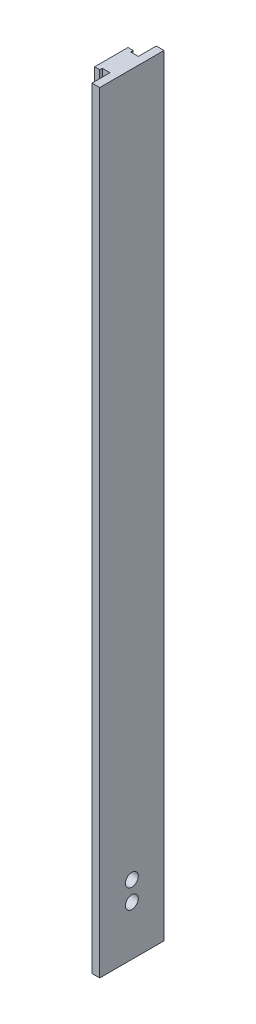
ISO-10303-21;
HEADER;
FILE_DESCRIPTION(('STEP AP214'),'2;1');
FILE_NAME('part.step','',(''),(''),'','','');
FILE_SCHEMA(('AUTOMOTIVE_DESIGN { 1 0 10303 214 1 1 1 1 }'));
ENDSEC;
DATA;
#1=APPLICATION_CONTEXT('core data for automotive mechanical design processes');
#2=APPLICATION_PROTOCOL_DEFINITION('international standard','automotive_design',2000,#1);
#3=PRODUCT_CONTEXT('',#1,'mechanical');
#4=PRODUCT('Part','Part','',(#3));
#5=PRODUCT_RELATED_PRODUCT_CATEGORY('part','',(#4));
#6=PRODUCT_DEFINITION_FORMATION('','',#4);
#7=PRODUCT_DEFINITION_CONTEXT('part definition',#1,'design');
#8=PRODUCT_DEFINITION('design','',#6,#7);
#9=PRODUCT_DEFINITION_SHAPE('','',#8);
#10=(LENGTH_UNIT() NAMED_UNIT(*) SI_UNIT(.MILLI.,.METRE.));
#11=(NAMED_UNIT(*) PLANE_ANGLE_UNIT() SI_UNIT($,.RADIAN.));
#12=(NAMED_UNIT(*) SI_UNIT($,.STERADIAN.) SOLID_ANGLE_UNIT());
#13=UNCERTAINTY_MEASURE_WITH_UNIT(LENGTH_MEASURE(1.E-05),#10,'distance_accuracy_value','');
#14=(GEOMETRIC_REPRESENTATION_CONTEXT(3) GLOBAL_UNCERTAINTY_ASSIGNED_CONTEXT((#13)) GLOBAL_UNIT_ASSIGNED_CONTEXT((#10,
#11,#12)) REPRESENTATION_CONTEXT('',''));
#15=CARTESIAN_POINT('',(0.,0.,0.));
#16=DIRECTION('',(0.,0.,1.));
#17=DIRECTION('',(1.,0.,0.));
#18=AXIS2_PLACEMENT_3D('',#15,#16,#17);
#19=CARTESIAN_POINT('',(8.,28.7844036697248,10.5504587155963));
#20=DIRECTION('',(0.,0.,-1.));
#21=DIRECTION('',(0.,1.,0.));
#22=AXIS2_PLACEMENT_3D('',#19,#20,#21);
#23=PLANE('',#22);
#24=DIRECTION('',(-1.,0.,0.));
#25=VECTOR('',#24,1.);
#26=CARTESIAN_POINT('',(8.,28.7844036697248,10.5504587155963));
#27=LINE('',#26,#25);
#28=CARTESIAN_POINT('',(8.,28.7844036697248,10.5504587155963));
#29=VERTEX_POINT('',#28);
#30=CARTESIAN_POINT('',(5.,28.7844036697248,10.5504587155963));
#31=VERTEX_POINT('',#30);
#32=EDGE_CURVE('E209',#29,#31,#27,.T.);
#33=ORIENTED_EDGE('',*,*,#32,.T.);
#34=DIRECTION('',(0.,1.,0.));
#35=VECTOR('',#34,1.);
#36=CARTESIAN_POINT('',(5.,-271.215596330275,10.5504587155963));
#37=LINE('',#36,#35);
#38=CARTESIAN_POINT('',(5.,-271.215596330275,10.5504587155963));
#39=VERTEX_POINT('',#38);
#40=EDGE_CURVE('E157',#39,#31,#37,.T.);
#41=ORIENTED_EDGE('',*,*,#40,.F.);
#42=DIRECTION('',(-1.,0.,0.));
#43=VECTOR('',#42,1.);
#44=CARTESIAN_POINT('',(8.,-271.215596330275,10.5504587155963));
#45=LINE('',#44,#43);
#46=CARTESIAN_POINT('',(8.,-271.215596330275,10.5504587155963));
#47=VERTEX_POINT('',#46);
#48=EDGE_CURVE('E11',#47,#39,#45,.T.);
#49=ORIENTED_EDGE('',*,*,#48,.F.);
#50=DIRECTION('',(0.,-1.,0.));
#51=VECTOR('',#50,1.);
#52=CARTESIAN_POINT('',(8.,28.7844036697248,10.5504587155963));
#53=LINE('',#52,#51);
#54=EDGE_CURVE('E199',#29,#47,#53,.T.);
#55=ORIENTED_EDGE('',*,*,#54,.F.);
#56=EDGE_LOOP('',(#33,#41,#49,#55));
#57=FACE_BOUND('',#56,.T.);
#58=ADVANCED_FACE('F33',(#57),#23,.F.);
#59=CARTESIAN_POINT('',(8.,-271.215596330275,10.5504587155963));
#60=DIRECTION('',(0.,1.,0.));
#61=DIRECTION('',(0.,0.,1.));
#62=AXIS2_PLACEMENT_3D('',#59,#60,#61);
#63=PLANE('',#62);
#64=DIRECTION('',(1.,0.,0.));
#65=VECTOR('',#64,1.);
#66=CARTESIAN_POINT('',(2.,-271.215596330275,-7.45195898440367));
#67=LINE('',#66,#65);
#68=CARTESIAN_POINT('',(2.,-271.215596330275,-7.45195898440367));
#69=VERTEX_POINT('',#68);
#70=CARTESIAN_POINT('',(5.,-271.215596330275,-7.45195898440367));
#71=VERTEX_POINT('',#70);
#72=EDGE_CURVE('E136',#69,#71,#67,.T.);
#73=ORIENTED_EDGE('',*,*,#72,.T.);
#74=DIRECTION('',(0.,0.,-1.));
#75=VECTOR('',#74,1.);
#76=CARTESIAN_POINT('',(5.,-271.215596330275,-7.45195898440367));
#77=LINE('',#76,#75);
#78=CARTESIAN_POINT('',(5.,-271.215596330275,-14.4495412844037));
#79=VERTEX_POINT('',#78);
#80=EDGE_CURVE('E152',#71,#79,#77,.T.);
#81=ORIENTED_EDGE('',*,*,#80,.T.);
#82=DIRECTION('',(-1.,0.,0.));
#83=VECTOR('',#82,1.);
#84=CARTESIAN_POINT('',(8.,-271.215596330275,-14.4495412844037));
#85=LINE('',#84,#83);
#86=CARTESIAN_POINT('',(8.,-271.215596330275,-14.4495412844037));
#87=VERTEX_POINT('',#86);
#88=EDGE_CURVE('E40',#87,#79,#85,.T.);
#89=ORIENTED_EDGE('',*,*,#88,.F.);
#90=DIRECTION('',(0.,0.,-1.));
#91=VECTOR('',#90,1.);
#92=CARTESIAN_POINT('',(8.,-271.215596330275,10.5504587155963));
#93=LINE('',#92,#91);
#94=EDGE_CURVE('E202',#47,#87,#93,.T.);
#95=ORIENTED_EDGE('',*,*,#94,.F.);
#96=ORIENTED_EDGE('',*,*,#48,.T.);
#97=DIRECTION('',(0.,0.,-1.));
#98=VECTOR('',#97,1.);
#99=CARTESIAN_POINT('',(5.,-271.215596330275,3.55287641559633));
#100=LINE('',#99,#98);
#101=CARTESIAN_POINT('',(5.,-271.215596330275,3.55287641559633));
#102=VERTEX_POINT('',#101);
#103=EDGE_CURVE('E168',#39,#102,#100,.T.);
#104=ORIENTED_EDGE('',*,*,#103,.T.);
#105=DIRECTION('',(-1.,0.,0.));
#106=VECTOR('',#105,1.);
#107=CARTESIAN_POINT('',(2.,-271.215596330275,3.55287641559633));
#108=LINE('',#107,#106);
#109=CARTESIAN_POINT('',(2.,-271.215596330275,3.55287641559633));
#110=VERTEX_POINT('',#109);
#111=EDGE_CURVE('E171',#102,#110,#108,.T.);
#112=ORIENTED_EDGE('',*,*,#111,.T.);
#113=DIRECTION('',(0.,0.,1.));
#114=VECTOR('',#113,1.);
#115=CARTESIAN_POINT('',(2.,-271.215596330275,4.55287641559633));
#116=LINE('',#115,#114);
#117=CARTESIAN_POINT('',(2.,-271.215596330275,4.55287641559633));
#118=VERTEX_POINT('',#117);
#119=EDGE_CURVE('E174',#110,#118,#116,.T.);
#120=ORIENTED_EDGE('',*,*,#119,.T.);
#121=DIRECTION('',(-1.,0.,0.));
#122=VECTOR('',#121,1.);
#123=CARTESIAN_POINT('',(0.,-271.215596330275,4.55287641559633));
#124=LINE('',#123,#122);
#125=CARTESIAN_POINT('',(0.,-271.215596330275,4.55287641559633));
#126=VERTEX_POINT('',#125);
#127=EDGE_CURVE('E177',#118,#126,#124,.T.);
#128=ORIENTED_EDGE('',*,*,#127,.T.);
#129=DIRECTION('',(0.,0.,-1.));
#130=VECTOR('',#129,1.);
#131=CARTESIAN_POINT('',(0.,-271.215596330275,10.5504587155963));
#132=LINE('',#131,#130);
#133=CARTESIAN_POINT('',(0.,-271.215596330275,-8.45195898440367));
#134=VERTEX_POINT('',#133);
#135=EDGE_CURVE('E142',#126,#134,#132,.T.);
#136=ORIENTED_EDGE('',*,*,#135,.T.);
#137=DIRECTION('',(1.,0.,0.));
#138=VECTOR('',#137,1.);
#139=CARTESIAN_POINT('',(0.,-271.215596330275,-8.45195898440367));
#140=LINE('',#139,#138);
#141=CARTESIAN_POINT('',(2.,-271.215596330275,-8.45195898440367));
#142=VERTEX_POINT('',#141);
#143=EDGE_CURVE('E47',#134,#142,#140,.T.);
#144=ORIENTED_EDGE('',*,*,#143,.T.);
#145=DIRECTION('',(0.,0.,1.));
#146=VECTOR('',#145,1.);
#147=CARTESIAN_POINT('',(2.,-271.215596330275,-8.45195898440367));
#148=LINE('',#147,#146);
#149=EDGE_CURVE('E131',#142,#69,#148,.T.);
#150=ORIENTED_EDGE('',*,*,#149,.T.);
#151=EDGE_LOOP('',(#73,#81,#89,#95,#96,#104,#112,#120,#128,#136,#144,#150));
#152=FACE_BOUND('',#151,.T.);
#153=ADVANCED_FACE('F139',(#152),#63,.F.);
#154=CARTESIAN_POINT('',(8.,28.7844036697248,-14.4495412844037));
#155=DIRECTION('',(0.,0.,1.));
#156=DIRECTION('',(0.,-1.,0.));
#157=AXIS2_PLACEMENT_3D('',#154,#155,#156);
#158=PLANE('',#157);
#159=ORIENTED_EDGE('',*,*,#88,.T.);
#160=DIRECTION('',(0.,1.,0.));
#161=VECTOR('',#160,1.);
#162=CARTESIAN_POINT('',(5.,-271.215596330275,-14.4495412844037));
#163=LINE('',#162,#161);
#164=CARTESIAN_POINT('',(5.,28.7844036697248,-14.4495412844037));
#165=VERTEX_POINT('',#164);
#166=EDGE_CURVE('E161',#79,#165,#163,.T.);
#167=ORIENTED_EDGE('',*,*,#166,.T.);
#168=DIRECTION('',(-1.,0.,0.));
#169=VECTOR('',#168,1.);
#170=CARTESIAN_POINT('',(8.,28.7844036697248,-14.4495412844037));
#171=LINE('',#170,#169);
#172=CARTESIAN_POINT('',(8.,28.7844036697248,-14.4495412844037));
#173=VERTEX_POINT('',#172);
#174=EDGE_CURVE('E215',#173,#165,#171,.T.);
#175=ORIENTED_EDGE('',*,*,#174,.F.);
#176=DIRECTION('',(0.,1.,0.));
#177=VECTOR('',#176,1.);
#178=CARTESIAN_POINT('',(8.,28.7844036697248,-14.4495412844037));
#179=LINE('',#178,#177);
#180=EDGE_CURVE('E205',#87,#173,#179,.T.);
#181=ORIENTED_EDGE('',*,*,#180,.F.);
#182=EDGE_LOOP('',(#159,#167,#175,#181));
#183=FACE_BOUND('',#182,.T.);
#184=ADVANCED_FACE('F221',(#183),#158,.F.);
#185=CARTESIAN_POINT('',(8.,28.7844036697248,10.5504587155963));
#186=DIRECTION('',(0.,-1.,0.));
#187=DIRECTION('',(0.,0.,-1.));
#188=AXIS2_PLACEMENT_3D('',#185,#186,#187);
#189=PLANE('',#188);
#190=ORIENTED_EDGE('',*,*,#174,.T.);
#191=DIRECTION('',(0.,0.,-1.));
#192=VECTOR('',#191,1.);
#193=CARTESIAN_POINT('',(5.,28.7844036697248,-7.45195898440367));
#194=LINE('',#193,#192);
#195=CARTESIAN_POINT('',(5.,28.7844036697248,-7.45195898440367));
#196=VERTEX_POINT('',#195);
#197=EDGE_CURVE('E143',#196,#165,#194,.T.);
#198=ORIENTED_EDGE('',*,*,#197,.F.);
#199=DIRECTION('',(1.,0.,0.));
#200=VECTOR('',#199,1.);
#201=CARTESIAN_POINT('',(2.,28.7844036697248,-7.45195898440367));
#202=LINE('',#201,#200);
#203=CARTESIAN_POINT('',(2.,28.7844036697248,-7.45195898440367));
#204=VERTEX_POINT('',#203);
#205=EDGE_CURVE('E145',#204,#196,#202,.T.);
#206=ORIENTED_EDGE('',*,*,#205,.F.);
#207=DIRECTION('',(0.,0.,1.));
#208=VECTOR('',#207,1.);
#209=CARTESIAN_POINT('',(2.,28.7844036697248,-8.45195898440367));
#210=LINE('',#209,#208);
#211=CARTESIAN_POINT('',(2.,28.7844036697248,-8.45195898440367));
#212=VERTEX_POINT('',#211);
#213=EDGE_CURVE('E156',#212,#204,#210,.T.);
#214=ORIENTED_EDGE('',*,*,#213,.F.);
#215=DIRECTION('',(1.,0.,0.));
#216=VECTOR('',#215,1.);
#217=CARTESIAN_POINT('',(0.,28.7844036697248,-8.45195898440367));
#218=LINE('',#217,#216);
#219=CARTESIAN_POINT('',(0.,28.7844036697248,-8.45195898440367));
#220=VERTEX_POINT('',#219);
#221=EDGE_CURVE('E123',#220,#212,#218,.T.);
#222=ORIENTED_EDGE('',*,*,#221,.F.);
#223=DIRECTION('',(0.,0.,1.));
#224=VECTOR('',#223,1.);
#225=CARTESIAN_POINT('',(0.,28.7844036697248,10.5504587155963));
#226=LINE('',#225,#224);
#227=CARTESIAN_POINT('',(0.,28.7844036697248,4.55287641559633));
#228=VERTEX_POINT('',#227);
#229=EDGE_CURVE('E203',#220,#228,#226,.T.);
#230=ORIENTED_EDGE('',*,*,#229,.T.);
#231=DIRECTION('',(-1.,0.,0.));
#232=VECTOR('',#231,1.);
#233=CARTESIAN_POINT('',(0.,28.7844036697248,4.55287641559633));
#234=LINE('',#233,#232);
#235=CARTESIAN_POINT('',(2.,28.7844036697248,4.55287641559633));
#236=VERTEX_POINT('',#235);
#237=EDGE_CURVE('E55',#236,#228,#234,.T.);
#238=ORIENTED_EDGE('',*,*,#237,.F.);
#239=DIRECTION('',(0.,0.,1.));
#240=VECTOR('',#239,1.);
#241=CARTESIAN_POINT('',(2.,28.7844036697248,4.55287641559633));
#242=LINE('',#241,#240);
#243=CARTESIAN_POINT('',(2.,28.7844036697248,3.55287641559633));
#244=VERTEX_POINT('',#243);
#245=EDGE_CURVE('E187',#244,#236,#242,.T.);
#246=ORIENTED_EDGE('',*,*,#245,.F.);
#247=DIRECTION('',(-1.,0.,0.));
#248=VECTOR('',#247,1.);
#249=CARTESIAN_POINT('',(2.,28.7844036697248,3.55287641559633));
#250=LINE('',#249,#248);
#251=CARTESIAN_POINT('',(5.,28.7844036697248,3.55287641559633));
#252=VERTEX_POINT('',#251);
#253=EDGE_CURVE('E183',#252,#244,#250,.T.);
#254=ORIENTED_EDGE('',*,*,#253,.F.);
#255=DIRECTION('',(0.,0.,-1.));
#256=VECTOR('',#255,1.);
#257=CARTESIAN_POINT('',(5.,28.7844036697248,3.55287641559633));
#258=LINE('',#257,#256);
#259=EDGE_CURVE('E180',#31,#252,#258,.T.);
#260=ORIENTED_EDGE('',*,*,#259,.F.);
#261=ORIENTED_EDGE('',*,*,#32,.F.);
#262=DIRECTION('',(0.,0.,1.));
#263=VECTOR('',#262,1.);
#264=CARTESIAN_POINT('',(8.,28.7844036697248,10.5504587155963));
#265=LINE('',#264,#263);
#266=EDGE_CURVE('E207',#173,#29,#265,.T.);
#267=ORIENTED_EDGE('',*,*,#266,.F.);
#268=EDGE_LOOP('',(#190,#198,#206,#214,#222,#230,#238,#246,#254,#260,#261,#267));
#269=FACE_BOUND('',#268,.T.);
#270=ADVANCED_FACE('F229',(#269),#189,.F.);
#271=CARTESIAN_POINT('',(8.,0.,0.));
#272=DIRECTION('',(1.,0.,0.));
#273=DIRECTION('',(0.,0.,-1.));
#274=AXIS2_PLACEMENT_3D('',#271,#272,#273);
#275=PLANE('',#274);
#276=CARTESIAN_POINT('',(8.,-251.87603792699,-1.94954128440371));
#277=DIRECTION('',(1.,0.,0.));
#278=DIRECTION('',(0.,0.,-1.));
#279=AXIS2_PLACEMENT_3D('',#276,#277,#278);
#280=CIRCLE('',#279,2.5);
#281=CARTESIAN_POINT('',(8.,-251.87603792699,-4.44954128440371));
#282=VERTEX_POINT('',#281);
#283=EDGE_CURVE('E313',#282,#282,#280,.T.);
#284=ORIENTED_EDGE('',*,*,#283,.F.);
#285=EDGE_LOOP('',(#284));
#286=FACE_BOUND('',#285,.T.);
#287=CARTESIAN_POINT('',(8.,-244.37603792699,-1.94954128440371));
#288=DIRECTION('',(1.,0.,0.));
#289=DIRECTION('',(0.,0.,-1.));
#290=AXIS2_PLACEMENT_3D('',#287,#288,#289);
#291=CIRCLE('',#290,2.5);
#292=CARTESIAN_POINT('',(8.,-244.37603792699,-4.44954128440371));
#293=VERTEX_POINT('',#292);
#294=EDGE_CURVE('E148',#293,#293,#291,.T.);
#295=ORIENTED_EDGE('',*,*,#294,.F.);
#296=EDGE_LOOP('',(#295));
#297=FACE_BOUND('',#296,.T.);
#298=ORIENTED_EDGE('',*,*,#54,.T.);
#299=ORIENTED_EDGE('',*,*,#94,.T.);
#300=ORIENTED_EDGE('',*,*,#180,.T.);
#301=ORIENTED_EDGE('',*,*,#266,.T.);
#302=EDGE_LOOP('',(#298,#299,#300,#301));
#303=FACE_BOUND('',#302,.T.);
#304=ADVANCED_FACE('F235',(#286,#297,#303),#275,.T.);
#305=CARTESIAN_POINT('',(0.,0.,0.));
#306=DIRECTION('',(1.,0.,0.));
#307=DIRECTION('',(0.,0.,-1.));
#308=AXIS2_PLACEMENT_3D('',#305,#306,#307);
#309=PLANE('',#308);
#310=CARTESIAN_POINT('',(0.,-251.87603792699,-1.94954128440371));
#311=DIRECTION('',(1.,0.,0.));
#312=DIRECTION('',(0.,0.,-1.));
#313=AXIS2_PLACEMENT_3D('',#310,#311,#312);
#314=CIRCLE('',#313,2.5);
#315=CARTESIAN_POINT('',(0.,-251.87603792699,-4.44954128440371));
#316=VERTEX_POINT('',#315);
#317=EDGE_CURVE('E184',#316,#316,#314,.T.);
#318=ORIENTED_EDGE('',*,*,#317,.T.);
#319=EDGE_LOOP('',(#318));
#320=FACE_BOUND('',#319,.T.);
#321=CARTESIAN_POINT('',(0.,-244.37603792699,-1.94954128440371));
#322=DIRECTION('',(1.,0.,0.));
#323=DIRECTION('',(0.,0.,-1.));
#324=AXIS2_PLACEMENT_3D('',#321,#322,#323);
#325=CIRCLE('',#324,2.5);
#326=CARTESIAN_POINT('',(0.,-244.37603792699,-4.44954128440371));
#327=VERTEX_POINT('',#326);
#328=EDGE_CURVE('E309',#327,#327,#325,.T.);
#329=ORIENTED_EDGE('',*,*,#328,.T.);
#330=EDGE_LOOP('',(#329));
#331=FACE_BOUND('',#330,.T.);
#332=ORIENTED_EDGE('',*,*,#229,.F.);
#333=DIRECTION('',(0.,1.,0.));
#334=VECTOR('',#333,1.);
#335=CARTESIAN_POINT('',(0.,-271.215596330275,-8.45195898440367));
#336=LINE('',#335,#334);
#337=EDGE_CURVE('E128',#134,#220,#336,.T.);
#338=ORIENTED_EDGE('',*,*,#337,.F.);
#339=ORIENTED_EDGE('',*,*,#135,.F.);
#340=DIRECTION('',(0.,1.,0.));
#341=VECTOR('',#340,1.);
#342=CARTESIAN_POINT('',(0.,-271.215596330275,4.55287641559633));
#343=LINE('',#342,#341);
#344=EDGE_CURVE('E192',#126,#228,#343,.T.);
#345=ORIENTED_EDGE('',*,*,#344,.T.);
#346=EDGE_LOOP('',(#332,#338,#339,#345));
#347=FACE_BOUND('',#346,.T.);
#348=ADVANCED_FACE('F252',(#320,#331,#347),#309,.F.);
#349=CARTESIAN_POINT('',(5.,-271.215596330275,3.55287641559633));
#350=DIRECTION('',(1.,0.,0.));
#351=DIRECTION('',(0.,0.,-1.));
#352=AXIS2_PLACEMENT_3D('',#349,#350,#351);
#353=PLANE('',#352);
#354=ORIENTED_EDGE('',*,*,#259,.T.);
#355=DIRECTION('',(0.,1.,0.));
#356=VECTOR('',#355,1.);
#357=CARTESIAN_POINT('',(5.,-271.215596330275,3.55287641559633));
#358=LINE('',#357,#356);
#359=EDGE_CURVE('E179',#102,#252,#358,.T.);
#360=ORIENTED_EDGE('',*,*,#359,.F.);
#361=ORIENTED_EDGE('',*,*,#103,.F.);
#362=ORIENTED_EDGE('',*,*,#40,.T.);
#363=EDGE_LOOP('',(#354,#360,#361,#362));
#364=FACE_BOUND('',#363,.T.);
#365=ADVANCED_FACE('F241',(#364),#353,.F.);
#366=CARTESIAN_POINT('',(0.,-271.215596330275,4.55287641559633));
#367=DIRECTION('',(0.,0.,-1.));
#368=DIRECTION('',(-1.,0.,0.));
#369=AXIS2_PLACEMENT_3D('',#366,#367,#368);
#370=PLANE('',#369);
#371=ORIENTED_EDGE('',*,*,#237,.T.);
#372=ORIENTED_EDGE('',*,*,#344,.F.);
#373=ORIENTED_EDGE('',*,*,#127,.F.);
#374=DIRECTION('',(0.,1.,0.));
#375=VECTOR('',#374,1.);
#376=CARTESIAN_POINT('',(2.,-271.215596330275,4.55287641559633));
#377=LINE('',#376,#375);
#378=EDGE_CURVE('E194',#118,#236,#377,.T.);
#379=ORIENTED_EDGE('',*,*,#378,.T.);
#380=EDGE_LOOP('',(#371,#372,#373,#379));
#381=FACE_BOUND('',#380,.T.);
#382=ADVANCED_FACE('F253',(#381),#370,.F.);
#383=CARTESIAN_POINT('',(2.,-271.215596330275,4.55287641559633));
#384=DIRECTION('',(-1.,0.,0.));
#385=DIRECTION('',(0.,0.,1.));
#386=AXIS2_PLACEMENT_3D('',#383,#384,#385);
#387=PLANE('',#386);
#388=ORIENTED_EDGE('',*,*,#245,.T.);
#389=ORIENTED_EDGE('',*,*,#378,.F.);
#390=ORIENTED_EDGE('',*,*,#119,.F.);
#391=DIRECTION('',(0.,1.,0.));
#392=VECTOR('',#391,1.);
#393=CARTESIAN_POINT('',(2.,-271.215596330275,3.55287641559633));
#394=LINE('',#393,#392);
#395=EDGE_CURVE('E196',#110,#244,#394,.T.);
#396=ORIENTED_EDGE('',*,*,#395,.T.);
#397=EDGE_LOOP('',(#388,#389,#390,#396));
#398=FACE_BOUND('',#397,.T.);
#399=ADVANCED_FACE('F248',(#398),#387,.F.);
#400=CARTESIAN_POINT('',(2.,-271.215596330275,3.55287641559633));
#401=DIRECTION('',(0.,0.,-1.));
#402=DIRECTION('',(-1.,0.,0.));
#403=AXIS2_PLACEMENT_3D('',#400,#401,#402);
#404=PLANE('',#403);
#405=ORIENTED_EDGE('',*,*,#253,.T.);
#406=ORIENTED_EDGE('',*,*,#395,.F.);
#407=ORIENTED_EDGE('',*,*,#111,.F.);
#408=ORIENTED_EDGE('',*,*,#359,.T.);
#409=EDGE_LOOP('',(#405,#406,#407,#408));
#410=FACE_BOUND('',#409,.T.);
#411=ADVANCED_FACE('F244',(#410),#404,.F.);
#412=CARTESIAN_POINT('',(5.,-271.215596330275,-7.45195898440367));
#413=DIRECTION('',(1.,0.,0.));
#414=DIRECTION('',(0.,0.,-1.));
#415=AXIS2_PLACEMENT_3D('',#412,#413,#414);
#416=PLANE('',#415);
#417=ORIENTED_EDGE('',*,*,#197,.T.);
#418=ORIENTED_EDGE('',*,*,#166,.F.);
#419=ORIENTED_EDGE('',*,*,#80,.F.);
#420=DIRECTION('',(0.,1.,0.));
#421=VECTOR('',#420,1.);
#422=CARTESIAN_POINT('',(5.,-271.215596330275,-7.45195898440367));
#423=LINE('',#422,#421);
#424=EDGE_CURVE('E164',#71,#196,#423,.T.);
#425=ORIENTED_EDGE('',*,*,#424,.T.);
#426=EDGE_LOOP('',(#417,#418,#419,#425));
#427=FACE_BOUND('',#426,.T.);
#428=ADVANCED_FACE('F225',(#427),#416,.F.);
#429=CARTESIAN_POINT('',(2.,-271.215596330275,-7.45195898440367));
#430=DIRECTION('',(0.,0.,1.));
#431=DIRECTION('',(1.,0.,0.));
#432=AXIS2_PLACEMENT_3D('',#429,#430,#431);
#433=PLANE('',#432);
#434=ORIENTED_EDGE('',*,*,#205,.T.);
#435=ORIENTED_EDGE('',*,*,#424,.F.);
#436=ORIENTED_EDGE('',*,*,#72,.F.);
#437=DIRECTION('',(0.,1.,0.));
#438=VECTOR('',#437,1.);
#439=CARTESIAN_POINT('',(2.,-271.215596330275,-7.45195898440367));
#440=LINE('',#439,#438);
#441=EDGE_CURVE('E127',#69,#204,#440,.T.);
#442=ORIENTED_EDGE('',*,*,#441,.T.);
#443=EDGE_LOOP('',(#434,#435,#436,#442));
#444=FACE_BOUND('',#443,.T.);
#445=ADVANCED_FACE('F284',(#444),#433,.F.);
#446=CARTESIAN_POINT('',(2.,-271.215596330275,-8.45195898440367));
#447=DIRECTION('',(-1.,0.,0.));
#448=DIRECTION('',(0.,0.,1.));
#449=AXIS2_PLACEMENT_3D('',#446,#447,#448);
#450=PLANE('',#449);
#451=ORIENTED_EDGE('',*,*,#213,.T.);
#452=ORIENTED_EDGE('',*,*,#441,.F.);
#453=ORIENTED_EDGE('',*,*,#149,.F.);
#454=DIRECTION('',(0.,1.,0.));
#455=VECTOR('',#454,1.);
#456=CARTESIAN_POINT('',(2.,-271.215596330275,-8.45195898440367));
#457=LINE('',#456,#455);
#458=EDGE_CURVE('E119',#142,#212,#457,.T.);
#459=ORIENTED_EDGE('',*,*,#458,.T.);
#460=EDGE_LOOP('',(#451,#452,#453,#459));
#461=FACE_BOUND('',#460,.T.);
#462=ADVANCED_FACE('F132',(#461),#450,.F.);
#463=CARTESIAN_POINT('',(0.,-271.215596330275,-8.45195898440367));
#464=DIRECTION('',(0.,0.,1.));
#465=DIRECTION('',(1.,0.,0.));
#466=AXIS2_PLACEMENT_3D('',#463,#464,#465);
#467=PLANE('',#466);
#468=ORIENTED_EDGE('',*,*,#221,.T.);
#469=ORIENTED_EDGE('',*,*,#458,.F.);
#470=ORIENTED_EDGE('',*,*,#143,.F.);
#471=ORIENTED_EDGE('',*,*,#337,.T.);
#472=EDGE_LOOP('',(#468,#469,#470,#471));
#473=FACE_BOUND('',#472,.T.);
#474=ADVANCED_FACE('F121',(#473),#467,.F.);
#475=CARTESIAN_POINT('',(0.,-244.37603792699,-1.94954128440371));
#476=DIRECTION('',(1.,0.,0.));
#477=DIRECTION('',(0.,0.,-1.));
#478=AXIS2_PLACEMENT_3D('',#475,#476,#477);
#479=CYLINDRICAL_SURFACE('',#478,2.5);
#480=ORIENTED_EDGE('',*,*,#328,.F.);
#481=EDGE_LOOP('',(#480));
#482=FACE_BOUND('',#481,.T.);
#483=ORIENTED_EDGE('',*,*,#294,.T.);
#484=EDGE_LOOP('',(#483));
#485=FACE_BOUND('',#484,.T.);
#486=ADVANCED_FACE('F292',(#482,#485),#479,.F.);
#487=CARTESIAN_POINT('',(0.,-251.87603792699,-1.94954128440371));
#488=DIRECTION('',(1.,0.,0.));
#489=DIRECTION('',(0.,0.,-1.));
#490=AXIS2_PLACEMENT_3D('',#487,#488,#489);
#491=CYLINDRICAL_SURFACE('',#490,2.5);
#492=ORIENTED_EDGE('',*,*,#317,.F.);
#493=EDGE_LOOP('',(#492));
#494=FACE_BOUND('',#493,.T.);
#495=ORIENTED_EDGE('',*,*,#283,.T.);
#496=EDGE_LOOP('',(#495));
#497=FACE_BOUND('',#496,.T.);
#498=ADVANCED_FACE('F300',(#494,#497),#491,.F.);
#499=CLOSED_SHELL('',(#58,#153,#184,#270,#304,#348,#365,#382,#399,#411,#428,#445,#462,#474,#486,#498));
#500=MANIFOLD_SOLID_BREP('B2',#499);
#501=ADVANCED_BREP_SHAPE_REPRESENTATION('',(#18,#500),#14);
#502=SHAPE_DEFINITION_REPRESENTATION(#9,#501);
ENDSEC;
END-ISO-10303-21;
